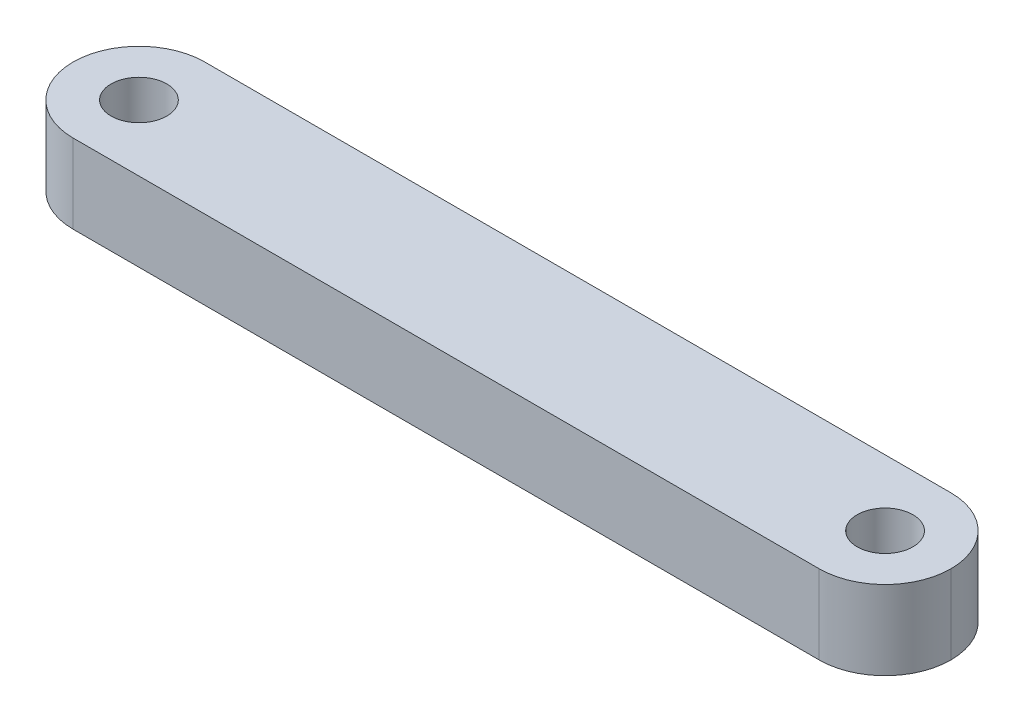
ISO-10303-21;
HEADER;
FILE_DESCRIPTION(('STEP AP214'),'2;1');
FILE_NAME('part.step','',(''),(''),'','','');
FILE_SCHEMA(('AUTOMOTIVE_DESIGN { 1 0 10303 214 1 1 1 1 }'));
ENDSEC;
DATA;
#1=APPLICATION_CONTEXT('core data for automotive mechanical design processes');
#2=APPLICATION_PROTOCOL_DEFINITION('international standard','automotive_design',2000,#1);
#3=PRODUCT_CONTEXT('',#1,'mechanical');
#4=PRODUCT('Part','Part','',(#3));
#5=PRODUCT_RELATED_PRODUCT_CATEGORY('part','',(#4));
#6=PRODUCT_DEFINITION_FORMATION('','',#4);
#7=PRODUCT_DEFINITION_CONTEXT('part definition',#1,'design');
#8=PRODUCT_DEFINITION('design','',#6,#7);
#9=PRODUCT_DEFINITION_SHAPE('','',#8);
#10=(LENGTH_UNIT() NAMED_UNIT(*) SI_UNIT(.MILLI.,.METRE.));
#11=(NAMED_UNIT(*) PLANE_ANGLE_UNIT() SI_UNIT($,.RADIAN.));
#12=(NAMED_UNIT(*) SI_UNIT($,.STERADIAN.) SOLID_ANGLE_UNIT());
#13=UNCERTAINTY_MEASURE_WITH_UNIT(LENGTH_MEASURE(1.E-05),#10,'distance_accuracy_value','');
#14=(GEOMETRIC_REPRESENTATION_CONTEXT(3) GLOBAL_UNCERTAINTY_ASSIGNED_CONTEXT((#13)) GLOBAL_UNIT_ASSIGNED_CONTEXT((#10,
#11,#12)) REPRESENTATION_CONTEXT('',''));
#15=CARTESIAN_POINT('',(0.,0.,0.));
#16=DIRECTION('',(0.,0.,1.));
#17=DIRECTION('',(1.,0.,0.));
#18=AXIS2_PLACEMENT_3D('',#15,#16,#17);
#19=CARTESIAN_POINT('',(0.,9.,-7.5));
#20=DIRECTION('',(0.,0.,-1.));
#21=DIRECTION('',(-1.,0.,0.));
#22=AXIS2_PLACEMENT_3D('',#19,#20,#21);
#23=PLANE('',#22);
#24=DIRECTION('',(1.,0.,0.));
#25=VECTOR('',#24,1.);
#26=CARTESIAN_POINT('',(0.,9.,-7.5));
#27=LINE('',#26,#25);
#28=CARTESIAN_POINT('',(-42.5,9.,-7.5));
#29=VERTEX_POINT('',#28);
#30=CARTESIAN_POINT('',(42.5,9.,-7.5));
#31=VERTEX_POINT('',#30);
#32=EDGE_CURVE('E131',#29,#31,#27,.T.);
#33=ORIENTED_EDGE('',*,*,#32,.T.);
#34=DIRECTION('',(0.,-1.,0.));
#35=VECTOR('',#34,1.);
#36=CARTESIAN_POINT('',(42.5,0.,-7.5));
#37=LINE('',#36,#35);
#38=CARTESIAN_POINT('',(42.5,0.,-7.5));
#39=VERTEX_POINT('',#38);
#40=EDGE_CURVE('E11',#31,#39,#37,.T.);
#41=ORIENTED_EDGE('',*,*,#40,.T.);
#42=DIRECTION('',(1.,0.,0.));
#43=VECTOR('',#42,1.);
#44=CARTESIAN_POINT('',(0.,0.,-7.5));
#45=LINE('',#44,#43);
#46=CARTESIAN_POINT('',(-42.5,0.,-7.5));
#47=VERTEX_POINT('',#46);
#48=EDGE_CURVE('E103',#47,#39,#45,.T.);
#49=ORIENTED_EDGE('',*,*,#48,.F.);
#50=DIRECTION('',(0.,-1.,0.));
#51=VECTOR('',#50,1.);
#52=CARTESIAN_POINT('',(-42.5,9.,-7.5));
#53=LINE('',#52,#51);
#54=EDGE_CURVE('E49',#47,#29,#53,.F.);
#55=ORIENTED_EDGE('',*,*,#54,.T.);
#56=EDGE_LOOP('',(#33,#41,#49,#55));
#57=FACE_BOUND('',#56,.T.);
#58=ADVANCED_FACE('F40',(#57),#23,.T.);
#59=CARTESIAN_POINT('',(42.5,9.,0.));
#60=DIRECTION('',(0.,-1.,0.));
#61=DIRECTION('',(0.,0.,-1.));
#62=AXIS2_PLACEMENT_3D('',#59,#60,#61);
#63=CYLINDRICAL_SURFACE('',#62,3.17500000000001);
#64=CARTESIAN_POINT('',(42.5,9.,0.));
#65=DIRECTION('',(0.,1.,0.));
#66=DIRECTION('',(0.,0.,1.));
#67=AXIS2_PLACEMENT_3D('',#64,#65,#66);
#68=CIRCLE('',#67,3.17500000000001);
#69=CARTESIAN_POINT('',(42.5,9.,3.175));
#70=VERTEX_POINT('',#69);
#71=EDGE_CURVE('E149',#70,#70,#68,.T.);
#72=ORIENTED_EDGE('',*,*,#71,.T.);
#73=EDGE_LOOP('',(#72));
#74=FACE_BOUND('',#73,.T.);
#75=CARTESIAN_POINT('',(42.5,0.,0.));
#76=DIRECTION('',(0.,1.,0.));
#77=DIRECTION('',(0.,0.,1.));
#78=AXIS2_PLACEMENT_3D('',#75,#76,#77);
#79=CIRCLE('',#78,3.17500000000001);
#80=CARTESIAN_POINT('',(42.5,0.,3.175));
#81=VERTEX_POINT('',#80);
#82=EDGE_CURVE('E160',#81,#81,#79,.T.);
#83=ORIENTED_EDGE('',*,*,#82,.F.);
#84=EDGE_LOOP('',(#83));
#85=FACE_BOUND('',#84,.T.);
#86=ADVANCED_FACE('F177',(#74,#85),#63,.F.);
#87=CARTESIAN_POINT('',(0.,9.,7.5));
#88=DIRECTION('',(0.,0.,-1.));
#89=DIRECTION('',(-1.,0.,0.));
#90=AXIS2_PLACEMENT_3D('',#87,#88,#89);
#91=PLANE('',#90);
#92=DIRECTION('',(1.,0.,0.));
#93=VECTOR('',#92,1.);
#94=CARTESIAN_POINT('',(0.,0.,7.5));
#95=LINE('',#94,#93);
#96=CARTESIAN_POINT('',(-42.5,0.,7.5));
#97=VERTEX_POINT('',#96);
#98=CARTESIAN_POINT('',(42.5,0.,7.5));
#99=VERTEX_POINT('',#98);
#100=EDGE_CURVE('E158',#97,#99,#95,.T.);
#101=ORIENTED_EDGE('',*,*,#100,.T.);
#102=DIRECTION('',(0.,-1.,0.));
#103=VECTOR('',#102,1.);
#104=CARTESIAN_POINT('',(42.5,9.,7.5));
#105=LINE('',#104,#103);
#106=CARTESIAN_POINT('',(42.5,9.,7.5));
#107=VERTEX_POINT('',#106);
#108=EDGE_CURVE('E115',#99,#107,#105,.F.);
#109=ORIENTED_EDGE('',*,*,#108,.T.);
#110=DIRECTION('',(1.,0.,0.));
#111=VECTOR('',#110,1.);
#112=CARTESIAN_POINT('',(0.,9.,7.5));
#113=LINE('',#112,#111);
#114=CARTESIAN_POINT('',(-42.5,9.,7.5));
#115=VERTEX_POINT('',#114);
#116=EDGE_CURVE('E137',#115,#107,#113,.T.);
#117=ORIENTED_EDGE('',*,*,#116,.F.);
#118=DIRECTION('',(0.,-1.,0.));
#119=VECTOR('',#118,1.);
#120=CARTESIAN_POINT('',(-42.5,0.,7.5));
#121=LINE('',#120,#119);
#122=EDGE_CURVE('E116',#115,#97,#121,.T.);
#123=ORIENTED_EDGE('',*,*,#122,.T.);
#124=EDGE_LOOP('',(#101,#109,#117,#123));
#125=FACE_BOUND('',#124,.T.);
#126=ADVANCED_FACE('F148',(#125),#91,.F.);
#127=CARTESIAN_POINT('',(-42.5,9.,0.));
#128=DIRECTION('',(0.,-1.,0.));
#129=DIRECTION('',(0.,0.,-1.));
#130=AXIS2_PLACEMENT_3D('',#127,#128,#129);
#131=CYLINDRICAL_SURFACE('',#130,3.17500000000001);
#132=CARTESIAN_POINT('',(-42.5,9.,0.));
#133=DIRECTION('',(0.,1.,0.));
#134=DIRECTION('',(0.,0.,1.));
#135=AXIS2_PLACEMENT_3D('',#132,#133,#134);
#136=CIRCLE('',#135,3.17500000000001);
#137=CARTESIAN_POINT('',(-42.5,9.,3.175));
#138=VERTEX_POINT('',#137);
#139=EDGE_CURVE('E152',#138,#138,#136,.T.);
#140=ORIENTED_EDGE('',*,*,#139,.T.);
#141=EDGE_LOOP('',(#140));
#142=FACE_BOUND('',#141,.T.);
#143=CARTESIAN_POINT('',(-42.5,0.,0.));
#144=DIRECTION('',(0.,1.,0.));
#145=DIRECTION('',(0.,0.,1.));
#146=AXIS2_PLACEMENT_3D('',#143,#144,#145);
#147=CIRCLE('',#146,3.17500000000001);
#148=CARTESIAN_POINT('',(-42.5,0.,3.175));
#149=VERTEX_POINT('',#148);
#150=EDGE_CURVE('E138',#149,#149,#147,.T.);
#151=ORIENTED_EDGE('',*,*,#150,.F.);
#152=EDGE_LOOP('',(#151));
#153=FACE_BOUND('',#152,.T.);
#154=ADVANCED_FACE('F168',(#142,#153),#131,.F.);
#155=CARTESIAN_POINT('',(0.,9.,0.));
#156=DIRECTION('',(0.,1.,0.));
#157=DIRECTION('',(0.,0.,1.));
#158=AXIS2_PLACEMENT_3D('',#155,#156,#157);
#159=PLANE('',#158);
#160=ORIENTED_EDGE('',*,*,#116,.T.);
#161=CARTESIAN_POINT('',(42.5,9.,0.));
#162=DIRECTION('',(0.,1.,0.));
#163=DIRECTION('',(0.,0.,1.));
#164=AXIS2_PLACEMENT_3D('',#161,#162,#163);
#165=CIRCLE('',#164,7.5);
#166=CARTESIAN_POINT('',(50.,9.,0.));
#167=VERTEX_POINT('',#166);
#168=EDGE_CURVE('E127',#107,#167,#165,.T.);
#169=ORIENTED_EDGE('',*,*,#168,.T.);
#170=CARTESIAN_POINT('',(42.5,9.,0.));
#171=DIRECTION('',(0.,1.,0.));
#172=DIRECTION('',(0.,0.,1.));
#173=AXIS2_PLACEMENT_3D('',#170,#171,#172);
#174=CIRCLE('',#173,7.5);
#175=EDGE_CURVE('E63',#167,#31,#174,.T.);
#176=ORIENTED_EDGE('',*,*,#175,.T.);
#177=ORIENTED_EDGE('',*,*,#32,.F.);
#178=CARTESIAN_POINT('',(-42.5,9.,0.));
#179=DIRECTION('',(0.,1.,0.));
#180=DIRECTION('',(0.,0.,1.));
#181=AXIS2_PLACEMENT_3D('',#178,#179,#180);
#182=CIRCLE('',#181,7.5);
#183=CARTESIAN_POINT('',(-50.,9.,0.));
#184=VERTEX_POINT('',#183);
#185=EDGE_CURVE('E57',#29,#184,#182,.T.);
#186=ORIENTED_EDGE('',*,*,#185,.T.);
#187=CARTESIAN_POINT('',(-42.5,9.,0.));
#188=DIRECTION('',(0.,1.,0.));
#189=DIRECTION('',(0.,0.,1.));
#190=AXIS2_PLACEMENT_3D('',#187,#188,#189);
#191=CIRCLE('',#190,7.5);
#192=EDGE_CURVE('E124',#184,#115,#191,.T.);
#193=ORIENTED_EDGE('',*,*,#192,.T.);
#194=EDGE_LOOP('',(#160,#169,#176,#177,#186,#193));
#195=FACE_BOUND('',#194,.T.);
#196=ORIENTED_EDGE('',*,*,#71,.F.);
#197=EDGE_LOOP('',(#196));
#198=FACE_BOUND('',#197,.T.);
#199=ORIENTED_EDGE('',*,*,#139,.F.);
#200=EDGE_LOOP('',(#199));
#201=FACE_BOUND('',#200,.T.);
#202=ADVANCED_FACE('F135',(#195,#198,#201),#159,.T.);
#203=CARTESIAN_POINT('',(0.,0.,0.));
#204=DIRECTION('',(0.,1.,0.));
#205=DIRECTION('',(0.,0.,1.));
#206=AXIS2_PLACEMENT_3D('',#203,#204,#205);
#207=PLANE('',#206);
#208=CARTESIAN_POINT('',(42.5,0.,0.));
#209=DIRECTION('',(0.,1.,0.));
#210=DIRECTION('',(0.,0.,1.));
#211=AXIS2_PLACEMENT_3D('',#208,#209,#210);
#212=CIRCLE('',#211,7.5);
#213=CARTESIAN_POINT('',(50.,0.,0.));
#214=VERTEX_POINT('',#213);
#215=EDGE_CURVE('E94',#39,#214,#212,.F.);
#216=ORIENTED_EDGE('',*,*,#215,.T.);
#217=CARTESIAN_POINT('',(42.5,0.,0.));
#218=DIRECTION('',(0.,1.,0.));
#219=DIRECTION('',(0.,0.,1.));
#220=AXIS2_PLACEMENT_3D('',#217,#218,#219);
#221=CIRCLE('',#220,7.5);
#222=EDGE_CURVE('E100',#214,#99,#221,.F.);
#223=ORIENTED_EDGE('',*,*,#222,.T.);
#224=ORIENTED_EDGE('',*,*,#100,.F.);
#225=CARTESIAN_POINT('',(-42.5,0.,0.));
#226=DIRECTION('',(0.,1.,0.));
#227=DIRECTION('',(0.,0.,1.));
#228=AXIS2_PLACEMENT_3D('',#225,#226,#227);
#229=CIRCLE('',#228,7.5);
#230=CARTESIAN_POINT('',(-50.,0.,0.));
#231=VERTEX_POINT('',#230);
#232=EDGE_CURVE('E106',#97,#231,#229,.F.);
#233=ORIENTED_EDGE('',*,*,#232,.T.);
#234=CARTESIAN_POINT('',(-42.5,0.,0.));
#235=DIRECTION('',(0.,1.,0.));
#236=DIRECTION('',(0.,0.,1.));
#237=AXIS2_PLACEMENT_3D('',#234,#235,#236);
#238=CIRCLE('',#237,7.5);
#239=EDGE_CURVE('E142',#231,#47,#238,.F.);
#240=ORIENTED_EDGE('',*,*,#239,.T.);
#241=ORIENTED_EDGE('',*,*,#48,.T.);
#242=EDGE_LOOP('',(#216,#223,#224,#233,#240,#241));
#243=FACE_BOUND('',#242,.T.);
#244=ORIENTED_EDGE('',*,*,#82,.T.);
#245=EDGE_LOOP('',(#244));
#246=FACE_BOUND('',#245,.T.);
#247=ORIENTED_EDGE('',*,*,#150,.T.);
#248=EDGE_LOOP('',(#247));
#249=FACE_BOUND('',#248,.T.);
#250=ADVANCED_FACE('F96',(#243,#246,#249),#207,.F.);
#251=CARTESIAN_POINT('',(42.5,9.,0.));
#252=DIRECTION('',(0.,1.,0.));
#253=DIRECTION('',(0.,0.,1.));
#254=AXIS2_PLACEMENT_3D('',#251,#252,#253);
#255=CYLINDRICAL_SURFACE('',#254,7.5);
#256=ORIENTED_EDGE('',*,*,#40,.F.);
#257=ORIENTED_EDGE('',*,*,#175,.F.);
#258=DIRECTION('',(0.,-1.,0.));
#259=VECTOR('',#258,1.);
#260=CARTESIAN_POINT('',(50.,9.,0.));
#261=LINE('',#260,#259);
#262=EDGE_CURVE('E109',#214,#167,#261,.F.);
#263=ORIENTED_EDGE('',*,*,#262,.F.);
#264=ORIENTED_EDGE('',*,*,#215,.F.);
#265=EDGE_LOOP('',(#256,#257,#263,#264));
#266=FACE_BOUND('',#265,.T.);
#267=ADVANCED_FACE('F110',(#266),#255,.T.);
#268=CARTESIAN_POINT('',(42.5,9.,0.));
#269=DIRECTION('',(0.,-1.,0.));
#270=DIRECTION('',(0.,0.,-1.));
#271=AXIS2_PLACEMENT_3D('',#268,#269,#270);
#272=CYLINDRICAL_SURFACE('',#271,7.5);
#273=ORIENTED_EDGE('',*,*,#168,.F.);
#274=ORIENTED_EDGE('',*,*,#108,.F.);
#275=ORIENTED_EDGE('',*,*,#222,.F.);
#276=ORIENTED_EDGE('',*,*,#262,.T.);
#277=EDGE_LOOP('',(#273,#274,#275,#276));
#278=FACE_BOUND('',#277,.T.);
#279=ADVANCED_FACE('F113',(#278),#272,.T.);
#280=CARTESIAN_POINT('',(-42.5,9.,0.));
#281=DIRECTION('',(0.,-1.,0.));
#282=DIRECTION('',(0.,0.,-1.));
#283=AXIS2_PLACEMENT_3D('',#280,#281,#282);
#284=CYLINDRICAL_SURFACE('',#283,7.5);
#285=DIRECTION('',(0.,-1.,0.));
#286=VECTOR('',#285,1.);
#287=CARTESIAN_POINT('',(-50.,9.,0.));
#288=LINE('',#287,#286);
#289=EDGE_CURVE('E44',#184,#231,#288,.T.);
#290=ORIENTED_EDGE('',*,*,#289,.F.);
#291=ORIENTED_EDGE('',*,*,#185,.F.);
#292=ORIENTED_EDGE('',*,*,#54,.F.);
#293=ORIENTED_EDGE('',*,*,#239,.F.);
#294=EDGE_LOOP('',(#290,#291,#292,#293));
#295=FACE_BOUND('',#294,.T.);
#296=ADVANCED_FACE('F42',(#295),#284,.T.);
#297=CARTESIAN_POINT('',(-42.5,9.,0.));
#298=DIRECTION('',(0.,1.,0.));
#299=DIRECTION('',(0.,0.,1.));
#300=AXIS2_PLACEMENT_3D('',#297,#298,#299);
#301=CYLINDRICAL_SURFACE('',#300,7.5);
#302=ORIENTED_EDGE('',*,*,#192,.F.);
#303=ORIENTED_EDGE('',*,*,#289,.T.);
#304=ORIENTED_EDGE('',*,*,#232,.F.);
#305=ORIENTED_EDGE('',*,*,#122,.F.);
#306=EDGE_LOOP('',(#302,#303,#304,#305));
#307=FACE_BOUND('',#306,.T.);
#308=ADVANCED_FACE('F145',(#307),#301,.T.);
#309=CLOSED_SHELL('',(#58,#86,#126,#154,#202,#250,#267,#279,#296,#308));
#310=MANIFOLD_SOLID_BREP('B2',#309);
#311=ADVANCED_BREP_SHAPE_REPRESENTATION('',(#18,#310),#14);
#312=SHAPE_DEFINITION_REPRESENTATION(#9,#311);
ENDSEC;
END-ISO-10303-21;
